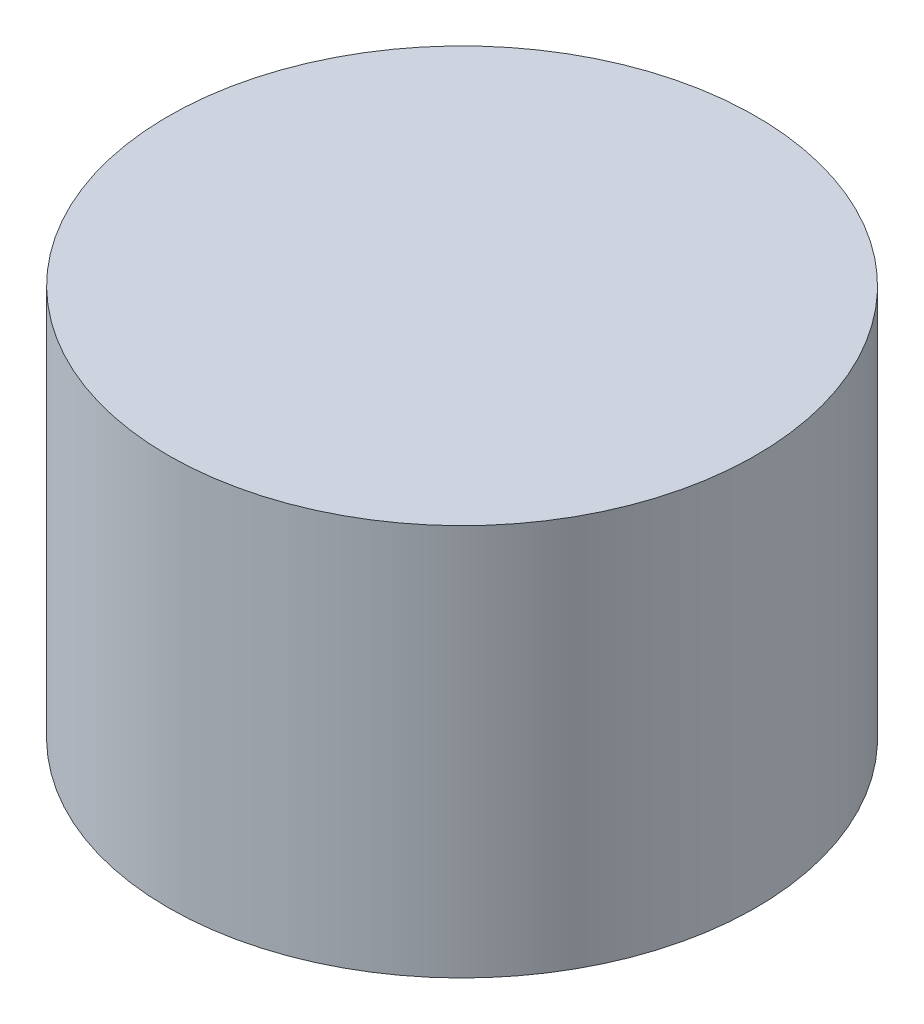
ISO-10303-21;
HEADER;
FILE_DESCRIPTION(('STEP AP214'),'2;1');
FILE_NAME('part.step','',(''),(''),'','','');
FILE_SCHEMA(('AUTOMOTIVE_DESIGN { 1 0 10303 214 1 1 1 1 }'));
ENDSEC;
DATA;
#1=APPLICATION_CONTEXT('core data for automotive mechanical design processes');
#2=APPLICATION_PROTOCOL_DEFINITION('international standard','automotive_design',2000,#1);
#3=PRODUCT_CONTEXT('',#1,'mechanical');
#4=PRODUCT('Part','Part','',(#3));
#5=PRODUCT_RELATED_PRODUCT_CATEGORY('part','',(#4));
#6=PRODUCT_DEFINITION_FORMATION('','',#4);
#7=PRODUCT_DEFINITION_CONTEXT('part definition',#1,'design');
#8=PRODUCT_DEFINITION('design','',#6,#7);
#9=PRODUCT_DEFINITION_SHAPE('','',#8);
#10=(LENGTH_UNIT() NAMED_UNIT(*) SI_UNIT(.MILLI.,.METRE.));
#11=(NAMED_UNIT(*) PLANE_ANGLE_UNIT() SI_UNIT($,.RADIAN.));
#12=(NAMED_UNIT(*) SI_UNIT($,.STERADIAN.) SOLID_ANGLE_UNIT());
#13=UNCERTAINTY_MEASURE_WITH_UNIT(LENGTH_MEASURE(1.E-05),#10,'distance_accuracy_value','');
#14=(GEOMETRIC_REPRESENTATION_CONTEXT(3) GLOBAL_UNCERTAINTY_ASSIGNED_CONTEXT((#13)) GLOBAL_UNIT_ASSIGNED_CONTEXT((#10,
#11,#12)) REPRESENTATION_CONTEXT('',''));
#15=CARTESIAN_POINT('',(0.,0.,0.));
#16=DIRECTION('',(0.,0.,1.));
#17=DIRECTION('',(1.,0.,0.));
#18=AXIS2_PLACEMENT_3D('',#15,#16,#17);
#19=CARTESIAN_POINT('',(0.,32.,0.));
#20=DIRECTION('',(0.,-1.,0.));
#21=DIRECTION('',(0.,0.,-1.));
#22=AXIS2_PLACEMENT_3D('',#19,#20,#21);
#23=CYLINDRICAL_SURFACE('',#22,24.);
#24=CARTESIAN_POINT('',(0.,32.,0.));
#25=DIRECTION('',(0.,1.,0.));
#26=DIRECTION('',(0.,0.,1.));
#27=AXIS2_PLACEMENT_3D('',#24,#25,#26);
#28=CIRCLE('',#27,24.);
#29=CARTESIAN_POINT('',(0.,32.,24.));
#30=VERTEX_POINT('',#29);
#31=EDGE_CURVE('E10',#30,#30,#28,.T.);
#32=ORIENTED_EDGE('',*,*,#31,.F.);
#33=EDGE_LOOP('',(#32));
#34=FACE_BOUND('',#33,.T.);
#35=CARTESIAN_POINT('',(0.,0.,0.));
#36=DIRECTION('',(0.,1.,0.));
#37=DIRECTION('',(0.,0.,1.));
#38=AXIS2_PLACEMENT_3D('',#35,#36,#37);
#39=CIRCLE('',#38,24.);
#40=CARTESIAN_POINT('',(0.,0.,24.));
#41=VERTEX_POINT('',#40);
#42=EDGE_CURVE('E48',#41,#41,#39,.T.);
#43=ORIENTED_EDGE('',*,*,#42,.T.);
#44=EDGE_LOOP('',(#43));
#45=FACE_BOUND('',#44,.T.);
#46=ADVANCED_FACE('F45',(#34,#45),#23,.T.);
#47=CARTESIAN_POINT('',(0.,32.,0.));
#48=DIRECTION('',(0.,1.,0.));
#49=DIRECTION('',(0.,0.,1.));
#50=AXIS2_PLACEMENT_3D('',#47,#48,#49);
#51=PLANE('',#50);
#52=ORIENTED_EDGE('',*,*,#31,.T.);
#53=EDGE_LOOP('',(#52));
#54=FACE_BOUND('',#53,.T.);
#55=ADVANCED_FACE('F60',(#54),#51,.T.);
#56=CARTESIAN_POINT('',(0.,0.,0.));
#57=DIRECTION('',(0.,1.,0.));
#58=DIRECTION('',(0.,0.,1.));
#59=AXIS2_PLACEMENT_3D('',#56,#57,#58);
#60=PLANE('',#59);
#61=ORIENTED_EDGE('',*,*,#42,.F.);
#62=EDGE_LOOP('',(#61));
#63=FACE_BOUND('',#62,.T.);
#64=ADVANCED_FACE('F58',(#63),#60,.F.);
#65=CLOSED_SHELL('',(#46,#55,#64));
#66=MANIFOLD_SOLID_BREP('B2',#65);
#67=ADVANCED_BREP_SHAPE_REPRESENTATION('',(#18,#66),#14);
#68=SHAPE_DEFINITION_REPRESENTATION(#9,#67);
ENDSEC;
END-ISO-10303-21;
